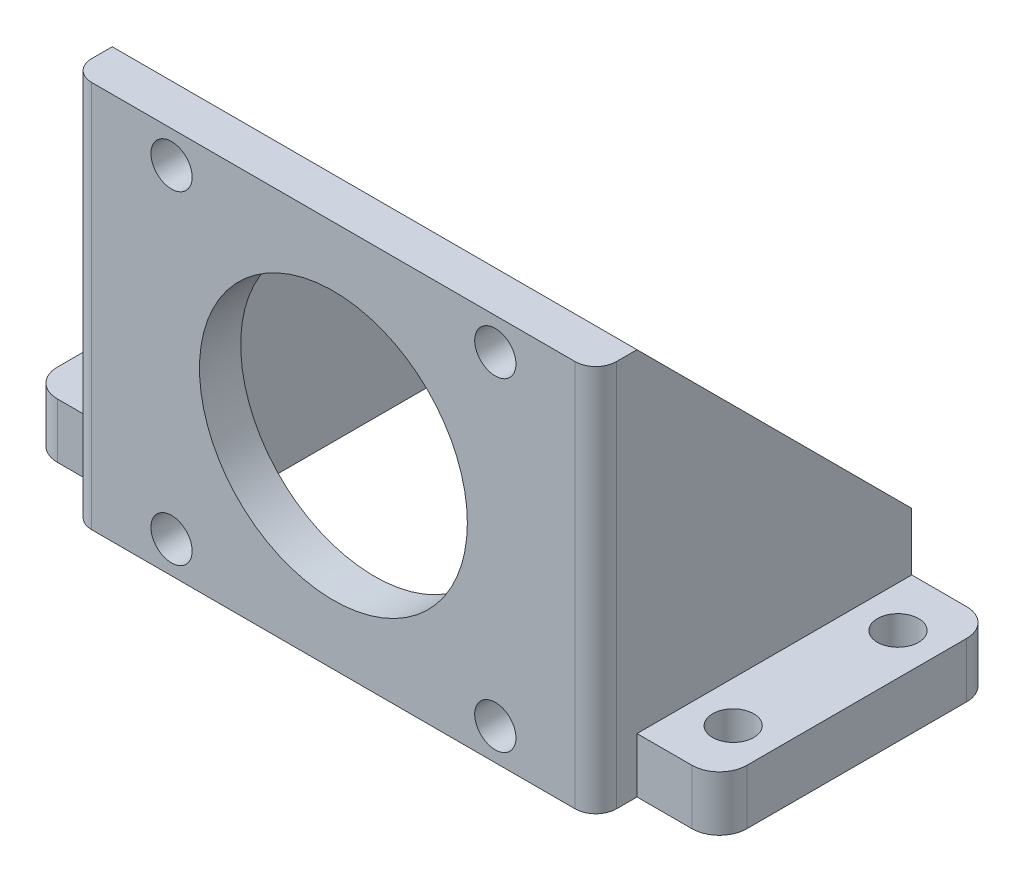
ISO-10303-21;
HEADER;
FILE_DESCRIPTION(('STEP AP214'),'2;1');
FILE_NAME('part.step','',(''),(''),'','','');
FILE_SCHEMA(('AUTOMOTIVE_DESIGN { 1 0 10303 214 1 1 1 1 }'));
ENDSEC;
DATA;
#1=APPLICATION_CONTEXT('core data for automotive mechanical design processes');
#2=APPLICATION_PROTOCOL_DEFINITION('international standard','automotive_design',2000,#1);
#3=PRODUCT_CONTEXT('',#1,'mechanical');
#4=PRODUCT('Part','Part','',(#3));
#5=PRODUCT_RELATED_PRODUCT_CATEGORY('part','',(#4));
#6=PRODUCT_DEFINITION_FORMATION('','',#4);
#7=PRODUCT_DEFINITION_CONTEXT('part definition',#1,'design');
#8=PRODUCT_DEFINITION('design','',#6,#7);
#9=PRODUCT_DEFINITION_SHAPE('','',#8);
#10=(LENGTH_UNIT() NAMED_UNIT(*) SI_UNIT(.MILLI.,.METRE.));
#11=(NAMED_UNIT(*) PLANE_ANGLE_UNIT() SI_UNIT($,.RADIAN.));
#12=(NAMED_UNIT(*) SI_UNIT($,.STERADIAN.) SOLID_ANGLE_UNIT());
#13=UNCERTAINTY_MEASURE_WITH_UNIT(LENGTH_MEASURE(1.E-05),#10,'distance_accuracy_value','');
#14=(GEOMETRIC_REPRESENTATION_CONTEXT(3) GLOBAL_UNCERTAINTY_ASSIGNED_CONTEXT((#13)) GLOBAL_UNIT_ASSIGNED_CONTEXT((#10,
#11,#12)) REPRESENTATION_CONTEXT('',''));
#15=CARTESIAN_POINT('',(0.,0.,0.));
#16=DIRECTION('',(0.,0.,1.));
#17=DIRECTION('',(1.,0.,0.));
#18=AXIS2_PLACEMENT_3D('',#15,#16,#17);
#19=CARTESIAN_POINT('',(76.4,0.,6.));
#20=DIRECTION('',(-1.,0.,0.));
#21=DIRECTION('',(0.,0.,1.));
#22=AXIS2_PLACEMENT_3D('',#19,#20,#21);
#23=PLANE('',#22);
#24=DIRECTION('',(0.,-1.,0.));
#25=VECTOR('',#24,1.);
#26=CARTESIAN_POINT('',(76.4,0.,-40.));
#27=LINE('',#26,#25);
#28=CARTESIAN_POINT('',(76.4,16.4,-40.));
#29=VERTEX_POINT('',#28);
#30=CARTESIAN_POINT('',(76.4,8.,-40.));
#31=VERTEX_POINT('',#30);
#32=EDGE_CURVE('E279',#29,#31,#27,.T.);
#33=ORIENTED_EDGE('',*,*,#32,.F.);
#34=DIRECTION('',(0.,-0.707106781186546,-0.707106781186549));
#35=VECTOR('',#34,1.);
#36=CARTESIAN_POINT('',(76.4,16.4,-40.));
#37=LINE('',#36,#35);
#38=CARTESIAN_POINT('',(76.4,56.4,1.45716771982052E-13));
#39=VERTEX_POINT('',#38);
#40=EDGE_CURVE('E41',#29,#39,#37,.F.);
#41=ORIENTED_EDGE('',*,*,#40,.T.);
#42=DIRECTION('',(0.,0.,-1.));
#43=VECTOR('',#42,1.);
#44=CARTESIAN_POINT('',(76.4,56.4,6.));
#45=LINE('',#44,#43);
#46=CARTESIAN_POINT('',(76.4,56.4,3.));
#47=VERTEX_POINT('',#46);
#48=EDGE_CURVE('E206',#47,#39,#45,.T.);
#49=ORIENTED_EDGE('',*,*,#48,.F.);
#50=DIRECTION('',(0.,1.,0.));
#51=VECTOR('',#50,1.);
#52=CARTESIAN_POINT('',(76.4,0.,3.));
#53=LINE('',#52,#51);
#54=CARTESIAN_POINT('',(76.4,0.,3.));
#55=VERTEX_POINT('',#54);
#56=EDGE_CURVE('E204',#47,#55,#53,.F.);
#57=ORIENTED_EDGE('',*,*,#56,.T.);
#58=DIRECTION('',(0.,0.,-1.));
#59=VECTOR('',#58,1.);
#60=CARTESIAN_POINT('',(76.4,0.,6.));
#61=LINE('',#60,#59);
#62=CARTESIAN_POINT('',(76.4,0.,0.));
#63=VERTEX_POINT('',#62);
#64=EDGE_CURVE('E181',#55,#63,#61,.T.);
#65=ORIENTED_EDGE('',*,*,#64,.T.);
#66=DIRECTION('',(0.,-1.,0.));
#67=VECTOR('',#66,1.);
#68=CARTESIAN_POINT('',(76.4,0.,0.));
#69=LINE('',#68,#67);
#70=CARTESIAN_POINT('',(76.4,8.,0.));
#71=VERTEX_POINT('',#70);
#72=EDGE_CURVE('E191',#71,#63,#69,.T.);
#73=ORIENTED_EDGE('',*,*,#72,.F.);
#74=DIRECTION('',(0.,0.,1.));
#75=VECTOR('',#74,1.);
#76=CARTESIAN_POINT('',(76.4,8.,0.));
#77=LINE('',#76,#75);
#78=EDGE_CURVE('E198',#31,#71,#77,.T.);
#79=ORIENTED_EDGE('',*,*,#78,.F.);
#80=EDGE_LOOP('',(#33,#41,#49,#57,#65,#73,#79));
#81=FACE_BOUND('',#80,.T.);
#82=ADVANCED_FACE('F33',(#81),#23,.F.);
#83=CARTESIAN_POINT('',(0.,0.,6.));
#84=DIRECTION('',(1.,0.,0.));
#85=DIRECTION('',(0.,0.,-1.));
#86=AXIS2_PLACEMENT_3D('',#83,#84,#85);
#87=PLANE('',#86);
#88=DIRECTION('',(0.,0.,-1.));
#89=VECTOR('',#88,1.);
#90=CARTESIAN_POINT('',(0.,56.4,6.));
#91=LINE('',#90,#89);
#92=CARTESIAN_POINT('',(0.,56.4,3.));
#93=VERTEX_POINT('',#92);
#94=CARTESIAN_POINT('',(0.,56.4,1.45716771982052E-13));
#95=VERTEX_POINT('',#94);
#96=EDGE_CURVE('E212',#93,#95,#91,.T.);
#97=ORIENTED_EDGE('',*,*,#96,.T.);
#98=DIRECTION('',(0.,-0.707106781186546,-0.707106781186549));
#99=VECTOR('',#98,1.);
#100=CARTESIAN_POINT('',(0.,16.4,-40.));
#101=LINE('',#100,#99);
#102=CARTESIAN_POINT('',(0.,16.4,-40.));
#103=VERTEX_POINT('',#102);
#104=EDGE_CURVE('E276',#95,#103,#101,.T.);
#105=ORIENTED_EDGE('',*,*,#104,.T.);
#106=DIRECTION('',(0.,1.,0.));
#107=VECTOR('',#106,1.);
#108=CARTESIAN_POINT('',(0.,0.,-40.));
#109=LINE('',#108,#107);
#110=CARTESIAN_POINT('',(0.,8.,-40.));
#111=VERTEX_POINT('',#110);
#112=EDGE_CURVE('E362',#111,#103,#109,.T.);
#113=ORIENTED_EDGE('',*,*,#112,.F.);
#114=DIRECTION('',(0.,0.,-1.));
#115=VECTOR('',#114,1.);
#116=CARTESIAN_POINT('',(0.,8.,-40.));
#117=LINE('',#116,#115);
#118=CARTESIAN_POINT('',(0.,8.,0.));
#119=VERTEX_POINT('',#118);
#120=EDGE_CURVE('E409',#119,#111,#117,.T.);
#121=ORIENTED_EDGE('',*,*,#120,.F.);
#122=DIRECTION('',(0.,1.,0.));
#123=VECTOR('',#122,1.);
#124=CARTESIAN_POINT('',(0.,0.,0.));
#125=LINE('',#124,#123);
#126=CARTESIAN_POINT('',(0.,0.,0.));
#127=VERTEX_POINT('',#126);
#128=EDGE_CURVE('E187',#127,#119,#125,.T.);
#129=ORIENTED_EDGE('',*,*,#128,.F.);
#130=DIRECTION('',(0.,0.,-1.));
#131=VECTOR('',#130,1.);
#132=CARTESIAN_POINT('',(0.,0.,6.));
#133=LINE('',#132,#131);
#134=CARTESIAN_POINT('',(0.,0.,3.));
#135=VERTEX_POINT('',#134);
#136=EDGE_CURVE('E205',#135,#127,#133,.T.);
#137=ORIENTED_EDGE('',*,*,#136,.F.);
#138=DIRECTION('',(0.,-1.,0.));
#139=VECTOR('',#138,1.);
#140=CARTESIAN_POINT('',(0.,0.,3.));
#141=LINE('',#140,#139);
#142=EDGE_CURVE('E230',#135,#93,#141,.F.);
#143=ORIENTED_EDGE('',*,*,#142,.T.);
#144=EDGE_LOOP('',(#97,#105,#113,#121,#129,#137,#143));
#145=FACE_BOUND('',#144,.T.);
#146=ADVANCED_FACE('F346',(#145),#87,.F.);
#147=CARTESIAN_POINT('',(0.,0.,0.));
#148=DIRECTION('',(0.,0.,-1.));
#149=DIRECTION('',(-1.,0.,0.));
#150=AXIS2_PLACEMENT_3D('',#147,#148,#149);
#151=PLANE('',#150);
#152=CARTESIAN_POINT('',(61.77,4.63,0.));
#153=DIRECTION('',(0.,0.,1.));
#154=DIRECTION('',(1.,0.,0.));
#155=AXIS2_PLACEMENT_3D('',#152,#153,#154);
#156=CIRCLE('',#155,3.00000000000001);
#157=CARTESIAN_POINT('',(64.77,4.63,0.));
#158=VERTEX_POINT('',#157);
#159=EDGE_CURVE('E307',#158,#158,#156,.T.);
#160=ORIENTED_EDGE('',*,*,#159,.T.);
#161=EDGE_LOOP('',(#160));
#162=FACE_BOUND('',#161,.T.);
#163=CARTESIAN_POINT('',(14.63,51.77,0.));
#164=DIRECTION('',(0.,0.,1.));
#165=DIRECTION('',(1.,0.,0.));
#166=AXIS2_PLACEMENT_3D('',#163,#164,#165);
#167=CIRCLE('',#166,2.99999999999999);
#168=CARTESIAN_POINT('',(17.63,51.77,0.));
#169=VERTEX_POINT('',#168);
#170=EDGE_CURVE('E319',#169,#169,#167,.T.);
#171=ORIENTED_EDGE('',*,*,#170,.T.);
#172=EDGE_LOOP('',(#171));
#173=FACE_BOUND('',#172,.T.);
#174=CARTESIAN_POINT('',(38.2,28.2,0.));
#175=DIRECTION('',(0.,0.,1.));
#176=DIRECTION('',(1.,0.,0.));
#177=AXIS2_PLACEMENT_3D('',#174,#175,#176);
#178=CIRCLE('',#177,19.5);
#179=CARTESIAN_POINT('',(57.7,28.2,0.));
#180=VERTEX_POINT('',#179);
#181=EDGE_CURVE('E325',#180,#180,#178,.T.);
#182=ORIENTED_EDGE('',*,*,#181,.T.);
#183=EDGE_LOOP('',(#182));
#184=FACE_BOUND('',#183,.T.);
#185=CARTESIAN_POINT('',(61.77,51.77,0.));
#186=DIRECTION('',(0.,0.,1.));
#187=DIRECTION('',(1.,0.,0.));
#188=AXIS2_PLACEMENT_3D('',#185,#186,#187);
#189=CIRCLE('',#188,3.00000000000001);
#190=CARTESIAN_POINT('',(64.77,51.77,0.));
#191=VERTEX_POINT('',#190);
#192=EDGE_CURVE('E313',#191,#191,#189,.T.);
#193=ORIENTED_EDGE('',*,*,#192,.T.);
#194=EDGE_LOOP('',(#193));
#195=FACE_BOUND('',#194,.T.);
#196=CARTESIAN_POINT('',(14.63,4.63,0.));
#197=DIRECTION('',(0.,0.,1.));
#198=DIRECTION('',(1.,0.,0.));
#199=AXIS2_PLACEMENT_3D('',#196,#197,#198);
#200=CIRCLE('',#199,2.99999999999999);
#201=CARTESIAN_POINT('',(17.63,4.63,0.));
#202=VERTEX_POINT('',#201);
#203=EDGE_CURVE('E296',#202,#202,#200,.T.);
#204=ORIENTED_EDGE('',*,*,#203,.T.);
#205=EDGE_LOOP('',(#204));
#206=FACE_BOUND('',#205,.T.);
#207=DIRECTION('',(1.,0.,0.));
#208=VECTOR('',#207,1.);
#209=CARTESIAN_POINT('',(0.,0.,0.));
#210=LINE('',#209,#208);
#211=CARTESIAN_POINT('',(9.5,0.,0.));
#212=VERTEX_POINT('',#211);
#213=CARTESIAN_POINT('',(66.9,0.,0.));
#214=VERTEX_POINT('',#213);
#215=EDGE_CURVE('E331',#212,#214,#210,.T.);
#216=ORIENTED_EDGE('',*,*,#215,.F.);
#217=DIRECTION('',(0.,-1.,0.));
#218=VECTOR('',#217,1.);
#219=CARTESIAN_POINT('',(9.5,0.,0.));
#220=LINE('',#219,#218);
#221=CARTESIAN_POINT('',(9.49999999999999,56.4,0.));
#222=VERTEX_POINT('',#221);
#223=EDGE_CURVE('E371',#222,#212,#220,.T.);
#224=ORIENTED_EDGE('',*,*,#223,.F.);
#225=DIRECTION('',(-1.,0.,0.));
#226=VECTOR('',#225,1.);
#227=CARTESIAN_POINT('',(0.,56.4,0.));
#228=LINE('',#227,#226);
#229=CARTESIAN_POINT('',(66.9,56.4,0.));
#230=VERTEX_POINT('',#229);
#231=EDGE_CURVE('E338',#230,#222,#228,.T.);
#232=ORIENTED_EDGE('',*,*,#231,.F.);
#233=DIRECTION('',(0.,1.,0.));
#234=VECTOR('',#233,1.);
#235=CARTESIAN_POINT('',(66.9,0.,0.));
#236=LINE('',#235,#234);
#237=EDGE_CURVE('E301',#214,#230,#236,.T.);
#238=ORIENTED_EDGE('',*,*,#237,.F.);
#239=EDGE_LOOP('',(#216,#224,#232,#238));
#240=FACE_BOUND('',#239,.T.);
#241=ADVANCED_FACE('F380',(#162,#173,#184,#195,#206,#240),#151,.T.);
#242=CARTESIAN_POINT('',(0.,0.,6.));
#243=DIRECTION('',(0.,0.,-1.));
#244=DIRECTION('',(-1.,0.,0.));
#245=AXIS2_PLACEMENT_3D('',#242,#243,#244);
#246=PLANE('',#245);
#247=DIRECTION('',(1.,0.,0.));
#248=VECTOR('',#247,1.);
#249=CARTESIAN_POINT('',(0.,0.,6.));
#250=LINE('',#249,#248);
#251=CARTESIAN_POINT('',(3.,0.,6.));
#252=VERTEX_POINT('',#251);
#253=CARTESIAN_POINT('',(73.4,0.,6.));
#254=VERTEX_POINT('',#253);
#255=EDGE_CURVE('E334',#252,#254,#250,.T.);
#256=ORIENTED_EDGE('',*,*,#255,.T.);
#257=DIRECTION('',(0.,1.,0.));
#258=VECTOR('',#257,1.);
#259=CARTESIAN_POINT('',(73.4,0.,6.));
#260=LINE('',#259,#258);
#261=CARTESIAN_POINT('',(73.4,56.4,6.));
#262=VERTEX_POINT('',#261);
#263=EDGE_CURVE('E218',#254,#262,#260,.T.);
#264=ORIENTED_EDGE('',*,*,#263,.T.);
#265=DIRECTION('',(-1.,0.,0.));
#266=VECTOR('',#265,1.);
#267=CARTESIAN_POINT('',(0.,56.4,6.));
#268=LINE('',#267,#266);
#269=CARTESIAN_POINT('',(3.,56.4,6.));
#270=VERTEX_POINT('',#269);
#271=EDGE_CURVE('E337',#262,#270,#268,.T.);
#272=ORIENTED_EDGE('',*,*,#271,.T.);
#273=DIRECTION('',(0.,-1.,0.));
#274=VECTOR('',#273,1.);
#275=CARTESIAN_POINT('',(3.,0.,6.));
#276=LINE('',#275,#274);
#277=EDGE_CURVE('E209',#270,#252,#276,.T.);
#278=ORIENTED_EDGE('',*,*,#277,.T.);
#279=EDGE_LOOP('',(#256,#264,#272,#278));
#280=FACE_BOUND('',#279,.T.);
#281=CARTESIAN_POINT('',(38.2,28.2,6.));
#282=DIRECTION('',(0.,0.,1.));
#283=DIRECTION('',(1.,0.,0.));
#284=AXIS2_PLACEMENT_3D('',#281,#282,#283);
#285=CIRCLE('',#284,19.5);
#286=CARTESIAN_POINT('',(57.7,28.2,6.));
#287=VERTEX_POINT('',#286);
#288=EDGE_CURVE('E328',#287,#287,#285,.T.);
#289=ORIENTED_EDGE('',*,*,#288,.F.);
#290=EDGE_LOOP('',(#289));
#291=FACE_BOUND('',#290,.T.);
#292=CARTESIAN_POINT('',(14.63,51.77,6.));
#293=DIRECTION('',(0.,0.,1.));
#294=DIRECTION('',(1.,0.,0.));
#295=AXIS2_PLACEMENT_3D('',#292,#293,#294);
#296=CIRCLE('',#295,2.99999999999999);
#297=CARTESIAN_POINT('',(17.63,51.77,6.));
#298=VERTEX_POINT('',#297);
#299=EDGE_CURVE('E322',#298,#298,#296,.T.);
#300=ORIENTED_EDGE('',*,*,#299,.F.);
#301=EDGE_LOOP('',(#300));
#302=FACE_BOUND('',#301,.T.);
#303=CARTESIAN_POINT('',(61.77,51.77,6.));
#304=DIRECTION('',(0.,0.,1.));
#305=DIRECTION('',(1.,0.,0.));
#306=AXIS2_PLACEMENT_3D('',#303,#304,#305);
#307=CIRCLE('',#306,3.00000000000001);
#308=CARTESIAN_POINT('',(64.77,51.77,6.));
#309=VERTEX_POINT('',#308);
#310=EDGE_CURVE('E316',#309,#309,#307,.T.);
#311=ORIENTED_EDGE('',*,*,#310,.F.);
#312=EDGE_LOOP('',(#311));
#313=FACE_BOUND('',#312,.T.);
#314=CARTESIAN_POINT('',(61.77,4.63,6.));
#315=DIRECTION('',(0.,0.,1.));
#316=DIRECTION('',(1.,0.,0.));
#317=AXIS2_PLACEMENT_3D('',#314,#315,#316);
#318=CIRCLE('',#317,3.00000000000001);
#319=CARTESIAN_POINT('',(64.77,4.63,6.));
#320=VERTEX_POINT('',#319);
#321=EDGE_CURVE('E310',#320,#320,#318,.T.);
#322=ORIENTED_EDGE('',*,*,#321,.F.);
#323=EDGE_LOOP('',(#322));
#324=FACE_BOUND('',#323,.T.);
#325=CARTESIAN_POINT('',(14.63,4.63,6.));
#326=DIRECTION('',(0.,0.,1.));
#327=DIRECTION('',(1.,0.,0.));
#328=AXIS2_PLACEMENT_3D('',#325,#326,#327);
#329=CIRCLE('',#328,2.99999999999999);
#330=CARTESIAN_POINT('',(17.63,4.63,6.));
#331=VERTEX_POINT('',#330);
#332=EDGE_CURVE('E304',#331,#331,#329,.T.);
#333=ORIENTED_EDGE('',*,*,#332,.F.);
#334=EDGE_LOOP('',(#333));
#335=FACE_BOUND('',#334,.T.);
#336=ADVANCED_FACE('F431',(#280,#291,#302,#313,#324,#335),#246,.F.);
#337=CARTESIAN_POINT('',(0.,0.,6.));
#338=DIRECTION('',(0.,1.,0.));
#339=DIRECTION('',(-1.,0.,0.));
#340=AXIS2_PLACEMENT_3D('',#337,#338,#339);
#341=PLANE('',#340);
#342=CARTESIAN_POINT('',(-6.,0.,-8.));
#343=DIRECTION('',(0.,1.,0.));
#344=DIRECTION('',(-1.,0.,0.));
#345=AXIS2_PLACEMENT_3D('',#342,#343,#344);
#346=CIRCLE('',#345,3.);
#347=CARTESIAN_POINT('',(-9.,0.,-8.));
#348=VERTEX_POINT('',#347);
#349=EDGE_CURVE('E464',#348,#348,#346,.T.);
#350=ORIENTED_EDGE('',*,*,#349,.T.);
#351=EDGE_LOOP('',(#350));
#352=FACE_BOUND('',#351,.T.);
#353=CARTESIAN_POINT('',(82.4,0.,-32.));
#354=DIRECTION('',(0.,1.,0.));
#355=DIRECTION('',(-1.,0.,0.));
#356=AXIS2_PLACEMENT_3D('',#353,#354,#355);
#357=CIRCLE('',#356,3.00000000000001);
#358=CARTESIAN_POINT('',(79.4,0.,-32.));
#359=VERTEX_POINT('',#358);
#360=EDGE_CURVE('E468',#359,#359,#357,.T.);
#361=ORIENTED_EDGE('',*,*,#360,.T.);
#362=EDGE_LOOP('',(#361));
#363=FACE_BOUND('',#362,.T.);
#364=CARTESIAN_POINT('',(82.4,0.,-8.));
#365=DIRECTION('',(0.,1.,0.));
#366=DIRECTION('',(-1.,0.,0.));
#367=AXIS2_PLACEMENT_3D('',#364,#365,#366);
#368=CIRCLE('',#367,3.00000000000001);
#369=CARTESIAN_POINT('',(79.4,0.,-8.));
#370=VERTEX_POINT('',#369);
#371=EDGE_CURVE('E472',#370,#370,#368,.T.);
#372=ORIENTED_EDGE('',*,*,#371,.T.);
#373=EDGE_LOOP('',(#372));
#374=FACE_BOUND('',#373,.T.);
#375=CARTESIAN_POINT('',(-6.,0.,-32.));
#376=DIRECTION('',(0.,1.,0.));
#377=DIRECTION('',(-1.,0.,0.));
#378=AXIS2_PLACEMENT_3D('',#375,#376,#377);
#379=CIRCLE('',#378,3.);
#380=CARTESIAN_POINT('',(-9.,0.,-32.));
#381=VERTEX_POINT('',#380);
#382=EDGE_CURVE('E199',#381,#381,#379,.T.);
#383=ORIENTED_EDGE('',*,*,#382,.T.);
#384=EDGE_LOOP('',(#383));
#385=FACE_BOUND('',#384,.T.);
#386=DIRECTION('',(1.,0.,0.));
#387=VECTOR('',#386,1.);
#388=CARTESIAN_POINT('',(-12.,0.,0.));
#389=LINE('',#388,#387);
#390=CARTESIAN_POINT('',(-8.,0.,0.));
#391=VERTEX_POINT('',#390);
#392=EDGE_CURVE('E376',#391,#127,#389,.T.);
#393=ORIENTED_EDGE('',*,*,#392,.F.);
#394=CARTESIAN_POINT('',(-8.,0.,-4.));
#395=DIRECTION('',(0.,1.,0.));
#396=DIRECTION('',(-1.,0.,0.));
#397=AXIS2_PLACEMENT_3D('',#394,#395,#396);
#398=CIRCLE('',#397,4.);
#399=CARTESIAN_POINT('',(-12.,0.,-4.));
#400=VERTEX_POINT('',#399);
#401=EDGE_CURVE('E249',#391,#400,#398,.F.);
#402=ORIENTED_EDGE('',*,*,#401,.T.);
#403=DIRECTION('',(0.,0.,1.));
#404=VECTOR('',#403,1.);
#405=CARTESIAN_POINT('',(-12.,0.,-40.));
#406=LINE('',#405,#404);
#407=CARTESIAN_POINT('',(-12.,0.,-36.));
#408=VERTEX_POINT('',#407);
#409=EDGE_CURVE('E405',#408,#400,#406,.T.);
#410=ORIENTED_EDGE('',*,*,#409,.F.);
#411=CARTESIAN_POINT('',(-8.,0.,-36.));
#412=DIRECTION('',(0.,1.,0.));
#413=DIRECTION('',(-1.,0.,0.));
#414=AXIS2_PLACEMENT_3D('',#411,#412,#413);
#415=CIRCLE('',#414,4.);
#416=CARTESIAN_POINT('',(-8.,0.,-40.));
#417=VERTEX_POINT('',#416);
#418=EDGE_CURVE('E247',#408,#417,#415,.F.);
#419=ORIENTED_EDGE('',*,*,#418,.T.);
#420=DIRECTION('',(-1.,0.,0.));
#421=VECTOR('',#420,1.);
#422=CARTESIAN_POINT('',(0.,0.,-40.));
#423=LINE('',#422,#421);
#424=CARTESIAN_POINT('',(9.5,0.,-40.));
#425=VERTEX_POINT('',#424);
#426=EDGE_CURVE('E368',#425,#417,#423,.T.);
#427=ORIENTED_EDGE('',*,*,#426,.F.);
#428=DIRECTION('',(0.,0.,1.));
#429=VECTOR('',#428,1.);
#430=CARTESIAN_POINT('',(9.5,0.,-40.));
#431=LINE('',#430,#429);
#432=EDGE_CURVE('E302',#425,#212,#431,.T.);
#433=ORIENTED_EDGE('',*,*,#432,.T.);
#434=ORIENTED_EDGE('',*,*,#215,.T.);
#435=DIRECTION('',(0.,0.,1.));
#436=VECTOR('',#435,1.);
#437=CARTESIAN_POINT('',(66.9,0.,-40.));
#438=LINE('',#437,#436);
#439=CARTESIAN_POINT('',(66.9,0.,-40.));
#440=VERTEX_POINT('',#439);
#441=EDGE_CURVE('E294',#440,#214,#438,.T.);
#442=ORIENTED_EDGE('',*,*,#441,.F.);
#443=DIRECTION('',(-1.,0.,0.));
#444=VECTOR('',#443,1.);
#445=CARTESIAN_POINT('',(76.4,0.,-40.));
#446=LINE('',#445,#444);
#447=CARTESIAN_POINT('',(84.4,0.,-40.));
#448=VERTEX_POINT('',#447);
#449=EDGE_CURVE('E291',#448,#440,#446,.T.);
#450=ORIENTED_EDGE('',*,*,#449,.F.);
#451=CARTESIAN_POINT('',(84.4,0.,-36.));
#452=DIRECTION('',(0.,1.,0.));
#453=DIRECTION('',(-1.,0.,0.));
#454=AXIS2_PLACEMENT_3D('',#451,#452,#453);
#455=CIRCLE('',#454,4.);
#456=CARTESIAN_POINT('',(88.4,0.,-36.));
#457=VERTEX_POINT('',#456);
#458=EDGE_CURVE('E245',#448,#457,#455,.F.);
#459=ORIENTED_EDGE('',*,*,#458,.T.);
#460=DIRECTION('',(0.,0.,-1.));
#461=VECTOR('',#460,1.);
#462=CARTESIAN_POINT('',(88.4,0.,0.));
#463=LINE('',#462,#461);
#464=CARTESIAN_POINT('',(88.4,0.,-4.));
#465=VERTEX_POINT('',#464);
#466=EDGE_CURVE('E394',#465,#457,#463,.T.);
#467=ORIENTED_EDGE('',*,*,#466,.F.);
#468=CARTESIAN_POINT('',(84.4,0.,-4.));
#469=DIRECTION('',(0.,1.,0.));
#470=DIRECTION('',(-1.,0.,0.));
#471=AXIS2_PLACEMENT_3D('',#468,#469,#470);
#472=CIRCLE('',#471,4.);
#473=CARTESIAN_POINT('',(84.4,0.,0.));
#474=VERTEX_POINT('',#473);
#475=EDGE_CURVE('E184',#465,#474,#472,.F.);
#476=ORIENTED_EDGE('',*,*,#475,.T.);
#477=DIRECTION('',(-1.,0.,0.));
#478=VECTOR('',#477,1.);
#479=CARTESIAN_POINT('',(88.4,0.,0.));
#480=LINE('',#479,#478);
#481=EDGE_CURVE('E176',#474,#63,#480,.T.);
#482=ORIENTED_EDGE('',*,*,#481,.T.);
#483=ORIENTED_EDGE('',*,*,#64,.F.);
#484=CARTESIAN_POINT('',(73.4,0.,3.));
#485=DIRECTION('',(0.,1.,0.));
#486=DIRECTION('',(-1.,0.,0.));
#487=AXIS2_PLACEMENT_3D('',#484,#485,#486);
#488=CIRCLE('',#487,3.);
#489=EDGE_CURVE('E228',#55,#254,#488,.F.);
#490=ORIENTED_EDGE('',*,*,#489,.T.);
#491=ORIENTED_EDGE('',*,*,#255,.F.);
#492=CARTESIAN_POINT('',(3.,0.,3.));
#493=DIRECTION('',(0.,1.,0.));
#494=DIRECTION('',(-1.,0.,0.));
#495=AXIS2_PLACEMENT_3D('',#492,#493,#494);
#496=CIRCLE('',#495,3.);
#497=EDGE_CURVE('E226',#252,#135,#496,.F.);
#498=ORIENTED_EDGE('',*,*,#497,.T.);
#499=ORIENTED_EDGE('',*,*,#136,.T.);
#500=EDGE_LOOP('',(#393,#402,#410,#419,#427,#433,#434,#442,#450,#459,#467,#476,#482,#483,#490,
#491,#498,#499));
#501=FACE_BOUND('',#500,.T.);
#502=ADVANCED_FACE('F179',(#352,#363,#374,#385,#501),#341,.F.);
#503=CARTESIAN_POINT('',(0.,56.4,6.));
#504=DIRECTION('',(0.,-1.,0.));
#505=DIRECTION('',(1.,0.,0.));
#506=AXIS2_PLACEMENT_3D('',#503,#504,#505);
#507=PLANE('',#506);
#508=ORIENTED_EDGE('',*,*,#231,.T.);
#509=DIRECTION('',(-1.,0.,0.));
#510=VECTOR('',#509,1.);
#511=CARTESIAN_POINT('',(0.,56.4,1.45716771982052E-13));
#512=LINE('',#511,#510);
#513=EDGE_CURVE('E274',#222,#95,#512,.T.);
#514=ORIENTED_EDGE('',*,*,#513,.T.);
#515=ORIENTED_EDGE('',*,*,#96,.F.);
#516=CARTESIAN_POINT('',(3.,56.4,3.));
#517=DIRECTION('',(0.,-1.,0.));
#518=DIRECTION('',(1.,0.,0.));
#519=AXIS2_PLACEMENT_3D('',#516,#517,#518);
#520=CIRCLE('',#519,3.);
#521=EDGE_CURVE('E221',#93,#270,#520,.F.);
#522=ORIENTED_EDGE('',*,*,#521,.T.);
#523=ORIENTED_EDGE('',*,*,#271,.F.);
#524=CARTESIAN_POINT('',(73.4,56.4,3.));
#525=DIRECTION('',(0.,-1.,0.));
#526=DIRECTION('',(1.,0.,0.));
#527=AXIS2_PLACEMENT_3D('',#524,#525,#526);
#528=CIRCLE('',#527,3.);
#529=EDGE_CURVE('E223',#262,#47,#528,.F.);
#530=ORIENTED_EDGE('',*,*,#529,.T.);
#531=ORIENTED_EDGE('',*,*,#48,.T.);
#532=DIRECTION('',(-1.,0.,0.));
#533=VECTOR('',#532,1.);
#534=CARTESIAN_POINT('',(0.,56.4,1.45716771982052E-13));
#535=LINE('',#534,#533);
#536=EDGE_CURVE('E272',#39,#230,#535,.T.);
#537=ORIENTED_EDGE('',*,*,#536,.T.);
#538=EDGE_LOOP('',(#508,#514,#515,#522,#523,#530,#531,#537));
#539=FACE_BOUND('',#538,.T.);
#540=ADVANCED_FACE('F282',(#539),#507,.F.);
#541=CARTESIAN_POINT('',(38.2,28.2,6.));
#542=DIRECTION('',(0.,0.,-1.));
#543=DIRECTION('',(-1.,0.,0.));
#544=AXIS2_PLACEMENT_3D('',#541,#542,#543);
#545=CYLINDRICAL_SURFACE('',#544,19.5);
#546=ORIENTED_EDGE('',*,*,#288,.T.);
#547=EDGE_LOOP('',(#546));
#548=FACE_BOUND('',#547,.T.);
#549=ORIENTED_EDGE('',*,*,#181,.F.);
#550=EDGE_LOOP('',(#549));
#551=FACE_BOUND('',#550,.T.);
#552=ADVANCED_FACE('F459',(#548,#551),#545,.F.);
#553=CARTESIAN_POINT('',(14.63,51.77,6.));
#554=DIRECTION('',(0.,0.,-1.));
#555=DIRECTION('',(-1.,0.,0.));
#556=AXIS2_PLACEMENT_3D('',#553,#554,#555);
#557=CYLINDRICAL_SURFACE('',#556,2.99999999999999);
#558=ORIENTED_EDGE('',*,*,#299,.T.);
#559=EDGE_LOOP('',(#558));
#560=FACE_BOUND('',#559,.T.);
#561=ORIENTED_EDGE('',*,*,#170,.F.);
#562=EDGE_LOOP('',(#561));
#563=FACE_BOUND('',#562,.T.);
#564=ADVANCED_FACE('F576',(#560,#563),#557,.F.);
#565=CARTESIAN_POINT('',(61.77,51.77,6.));
#566=DIRECTION('',(0.,0.,-1.));
#567=DIRECTION('',(-1.,0.,0.));
#568=AXIS2_PLACEMENT_3D('',#565,#566,#567);
#569=CYLINDRICAL_SURFACE('',#568,3.00000000000001);
#570=ORIENTED_EDGE('',*,*,#310,.T.);
#571=EDGE_LOOP('',(#570));
#572=FACE_BOUND('',#571,.T.);
#573=ORIENTED_EDGE('',*,*,#192,.F.);
#574=EDGE_LOOP('',(#573));
#575=FACE_BOUND('',#574,.T.);
#576=ADVANCED_FACE('F572',(#572,#575),#569,.F.);
#577=CARTESIAN_POINT('',(61.77,4.63,6.));
#578=DIRECTION('',(0.,0.,-1.));
#579=DIRECTION('',(-1.,0.,0.));
#580=AXIS2_PLACEMENT_3D('',#577,#578,#579);
#581=CYLINDRICAL_SURFACE('',#580,3.00000000000001);
#582=ORIENTED_EDGE('',*,*,#321,.T.);
#583=EDGE_LOOP('',(#582));
#584=FACE_BOUND('',#583,.T.);
#585=ORIENTED_EDGE('',*,*,#159,.F.);
#586=EDGE_LOOP('',(#585));
#587=FACE_BOUND('',#586,.T.);
#588=ADVANCED_FACE('F568',(#584,#587),#581,.F.);
#589=CARTESIAN_POINT('',(14.63,4.63,6.));
#590=DIRECTION('',(0.,0.,-1.));
#591=DIRECTION('',(-1.,0.,0.));
#592=AXIS2_PLACEMENT_3D('',#589,#590,#591);
#593=CYLINDRICAL_SURFACE('',#592,2.99999999999999);
#594=ORIENTED_EDGE('',*,*,#332,.T.);
#595=EDGE_LOOP('',(#594));
#596=FACE_BOUND('',#595,.T.);
#597=ORIENTED_EDGE('',*,*,#203,.F.);
#598=EDGE_LOOP('',(#597));
#599=FACE_BOUND('',#598,.T.);
#600=ADVANCED_FACE('F565',(#596,#599),#593,.F.);
#601=CARTESIAN_POINT('',(66.9,0.,-40.));
#602=DIRECTION('',(1.,0.,0.));
#603=DIRECTION('',(0.,0.,-1.));
#604=AXIS2_PLACEMENT_3D('',#601,#602,#603);
#605=PLANE('',#604);
#606=ORIENTED_EDGE('',*,*,#237,.T.);
#607=DIRECTION('',(0.,0.707106781186546,0.707106781186549));
#608=VECTOR('',#607,1.);
#609=CARTESIAN_POINT('',(66.9,16.4,-40.));
#610=LINE('',#609,#608);
#611=CARTESIAN_POINT('',(66.9,16.4,-40.));
#612=VERTEX_POINT('',#611);
#613=EDGE_CURVE('E11',#230,#612,#610,.F.);
#614=ORIENTED_EDGE('',*,*,#613,.T.);
#615=DIRECTION('',(0.,1.,0.));
#616=VECTOR('',#615,1.);
#617=CARTESIAN_POINT('',(66.9,0.,-40.));
#618=LINE('',#617,#616);
#619=EDGE_CURVE('E289',#440,#612,#618,.T.);
#620=ORIENTED_EDGE('',*,*,#619,.F.);
#621=ORIENTED_EDGE('',*,*,#441,.T.);
#622=EDGE_LOOP('',(#606,#614,#620,#621));
#623=FACE_BOUND('',#622,.T.);
#624=ADVANCED_FACE('F381',(#623),#605,.F.);
#625=CARTESIAN_POINT('',(0.,0.,-40.));
#626=DIRECTION('',(0.,0.,1.));
#627=DIRECTION('',(1.,0.,0.));
#628=AXIS2_PLACEMENT_3D('',#625,#626,#627);
#629=PLANE('',#628);
#630=ORIENTED_EDGE('',*,*,#619,.T.);
#631=DIRECTION('',(1.,0.,0.));
#632=VECTOR('',#631,1.);
#633=CARTESIAN_POINT('',(0.,16.4,-40.));
#634=LINE('',#633,#632);
#635=EDGE_CURVE('E278',#612,#29,#634,.T.);
#636=ORIENTED_EDGE('',*,*,#635,.T.);
#637=ORIENTED_EDGE('',*,*,#32,.T.);
#638=DIRECTION('',(-1.,0.,0.));
#639=VECTOR('',#638,1.);
#640=CARTESIAN_POINT('',(88.4,8.,-40.));
#641=LINE('',#640,#639);
#642=CARTESIAN_POINT('',(84.4,8.,-40.));
#643=VERTEX_POINT('',#642);
#644=EDGE_CURVE('E188',#643,#31,#641,.T.);
#645=ORIENTED_EDGE('',*,*,#644,.F.);
#646=DIRECTION('',(0.,1.,0.));
#647=VECTOR('',#646,1.);
#648=CARTESIAN_POINT('',(84.4,0.,-40.));
#649=LINE('',#648,#647);
#650=EDGE_CURVE('E263',#643,#448,#649,.F.);
#651=ORIENTED_EDGE('',*,*,#650,.T.);
#652=ORIENTED_EDGE('',*,*,#449,.T.);
#653=EDGE_LOOP('',(#630,#636,#637,#645,#651,#652));
#654=FACE_BOUND('',#653,.T.);
#655=ADVANCED_FACE('F286',(#654),#629,.F.);
#656=CARTESIAN_POINT('',(9.5,0.,-40.));
#657=DIRECTION('',(-1.,0.,0.));
#658=DIRECTION('',(0.,-1.,0.));
#659=AXIS2_PLACEMENT_3D('',#656,#657,#658);
#660=PLANE('',#659);
#661=DIRECTION('',(0.,-1.,0.));
#662=VECTOR('',#661,1.);
#663=CARTESIAN_POINT('',(9.5,0.,-40.));
#664=LINE('',#663,#662);
#665=CARTESIAN_POINT('',(9.5,16.4,-40.));
#666=VERTEX_POINT('',#665);
#667=EDGE_CURVE('E360',#666,#425,#664,.T.);
#668=ORIENTED_EDGE('',*,*,#667,.F.);
#669=DIRECTION('',(0.,0.707106781186546,0.707106781186549));
#670=VECTOR('',#669,1.);
#671=CARTESIAN_POINT('',(9.5,16.4,-40.));
#672=LINE('',#671,#670);
#673=EDGE_CURVE('E270',#666,#222,#672,.T.);
#674=ORIENTED_EDGE('',*,*,#673,.T.);
#675=ORIENTED_EDGE('',*,*,#223,.T.);
#676=ORIENTED_EDGE('',*,*,#432,.F.);
#677=EDGE_LOOP('',(#668,#674,#675,#676));
#678=FACE_BOUND('',#677,.T.);
#679=ADVANCED_FACE('F364',(#678),#660,.F.);
#680=CARTESIAN_POINT('',(0.,0.,-40.));
#681=DIRECTION('',(0.,0.,-1.));
#682=DIRECTION('',(-1.,0.,0.));
#683=AXIS2_PLACEMENT_3D('',#680,#681,#682);
#684=PLANE('',#683);
#685=ORIENTED_EDGE('',*,*,#112,.T.);
#686=DIRECTION('',(1.,0.,0.));
#687=VECTOR('',#686,1.);
#688=CARTESIAN_POINT('',(9.5,16.4,-40.));
#689=LINE('',#688,#687);
#690=EDGE_CURVE('E267',#103,#666,#689,.T.);
#691=ORIENTED_EDGE('',*,*,#690,.T.);
#692=ORIENTED_EDGE('',*,*,#667,.T.);
#693=ORIENTED_EDGE('',*,*,#426,.T.);
#694=DIRECTION('',(0.,-1.,0.));
#695=VECTOR('',#694,1.);
#696=CARTESIAN_POINT('',(-8.,8.,-40.));
#697=LINE('',#696,#695);
#698=CARTESIAN_POINT('',(-8.,8.,-40.));
#699=VERTEX_POINT('',#698);
#700=EDGE_CURVE('E251',#417,#699,#697,.F.);
#701=ORIENTED_EDGE('',*,*,#700,.T.);
#702=DIRECTION('',(1.,0.,0.));
#703=VECTOR('',#702,1.);
#704=CARTESIAN_POINT('',(-12.,8.,-40.));
#705=LINE('',#704,#703);
#706=EDGE_CURVE('E412',#699,#111,#705,.T.);
#707=ORIENTED_EDGE('',*,*,#706,.T.);
#708=EDGE_LOOP('',(#685,#691,#692,#693,#701,#707));
#709=FACE_BOUND('',#708,.T.);
#710=ADVANCED_FACE('F358',(#709),#684,.T.);
#711=CARTESIAN_POINT('',(73.4,0.,3.));
#712=DIRECTION('',(0.,1.,0.));
#713=DIRECTION('',(0.,0.,1.));
#714=AXIS2_PLACEMENT_3D('',#711,#712,#713);
#715=CYLINDRICAL_SURFACE('',#714,3.);
#716=ORIENTED_EDGE('',*,*,#489,.F.);
#717=ORIENTED_EDGE('',*,*,#56,.F.);
#718=ORIENTED_EDGE('',*,*,#529,.F.);
#719=ORIENTED_EDGE('',*,*,#263,.F.);
#720=EDGE_LOOP('',(#716,#717,#718,#719));
#721=FACE_BOUND('',#720,.T.);
#722=ADVANCED_FACE('F435',(#721),#715,.T.);
#723=CARTESIAN_POINT('',(3.,0.,3.));
#724=DIRECTION('',(0.,-1.,0.));
#725=DIRECTION('',(0.,0.,-1.));
#726=AXIS2_PLACEMENT_3D('',#723,#724,#725);
#727=CYLINDRICAL_SURFACE('',#726,3.);
#728=ORIENTED_EDGE('',*,*,#521,.F.);
#729=ORIENTED_EDGE('',*,*,#142,.F.);
#730=ORIENTED_EDGE('',*,*,#497,.F.);
#731=ORIENTED_EDGE('',*,*,#277,.F.);
#732=EDGE_LOOP('',(#728,#729,#730,#731));
#733=FACE_BOUND('',#732,.T.);
#734=ADVANCED_FACE('F429',(#733),#727,.T.);
#735=CARTESIAN_POINT('',(-12.,0.,0.));
#736=DIRECTION('',(0.,0.,-1.));
#737=DIRECTION('',(-1.,0.,0.));
#738=AXIS2_PLACEMENT_3D('',#735,#736,#737);
#739=PLANE('',#738);
#740=DIRECTION('',(1.,0.,0.));
#741=VECTOR('',#740,1.);
#742=CARTESIAN_POINT('',(-12.,8.,0.));
#743=LINE('',#742,#741);
#744=CARTESIAN_POINT('',(-8.,8.,0.));
#745=VERTEX_POINT('',#744);
#746=EDGE_CURVE('E418',#745,#119,#743,.T.);
#747=ORIENTED_EDGE('',*,*,#746,.F.);
#748=DIRECTION('',(0.,1.,0.));
#749=VECTOR('',#748,1.);
#750=CARTESIAN_POINT('',(-8.,0.,0.));
#751=LINE('',#750,#749);
#752=EDGE_CURVE('E242',#745,#391,#751,.F.);
#753=ORIENTED_EDGE('',*,*,#752,.T.);
#754=ORIENTED_EDGE('',*,*,#392,.T.);
#755=ORIENTED_EDGE('',*,*,#128,.T.);
#756=EDGE_LOOP('',(#747,#753,#754,#755));
#757=FACE_BOUND('',#756,.T.);
#758=ADVANCED_FACE('F422',(#757),#739,.F.);
#759=CARTESIAN_POINT('',(-12.,8.,-40.));
#760=DIRECTION('',(0.,-1.,0.));
#761=DIRECTION('',(0.,0.,-1.));
#762=AXIS2_PLACEMENT_3D('',#759,#760,#761);
#763=PLANE('',#762);
#764=CARTESIAN_POINT('',(-6.,8.,-8.));
#765=DIRECTION('',(0.,1.,0.));
#766=DIRECTION('',(0.,0.,1.));
#767=AXIS2_PLACEMENT_3D('',#764,#765,#766);
#768=CIRCLE('',#767,3.);
#769=CARTESIAN_POINT('',(-6.,8.,-5.));
#770=VERTEX_POINT('',#769);
#771=EDGE_CURVE('E483',#770,#770,#768,.T.);
#772=ORIENTED_EDGE('',*,*,#771,.F.);
#773=EDGE_LOOP('',(#772));
#774=FACE_BOUND('',#773,.T.);
#775=CARTESIAN_POINT('',(-6.,8.,-32.));
#776=DIRECTION('',(0.,1.,0.));
#777=DIRECTION('',(0.,0.,1.));
#778=AXIS2_PLACEMENT_3D('',#775,#776,#777);
#779=CIRCLE('',#778,3.);
#780=CARTESIAN_POINT('',(-6.,8.,-29.));
#781=VERTEX_POINT('',#780);
#782=EDGE_CURVE('E476',#781,#781,#779,.T.);
#783=ORIENTED_EDGE('',*,*,#782,.F.);
#784=EDGE_LOOP('',(#783));
#785=FACE_BOUND('',#784,.T.);
#786=DIRECTION('',(0.,0.,-1.));
#787=VECTOR('',#786,1.);
#788=CARTESIAN_POINT('',(-12.,8.,-40.));
#789=LINE('',#788,#787);
#790=CARTESIAN_POINT('',(-12.,8.,-4.));
#791=VERTEX_POINT('',#790);
#792=CARTESIAN_POINT('',(-12.,8.,-36.));
#793=VERTEX_POINT('',#792);
#794=EDGE_CURVE('E408',#791,#793,#789,.T.);
#795=ORIENTED_EDGE('',*,*,#794,.F.);
#796=CARTESIAN_POINT('',(-8.,8.,-4.));
#797=DIRECTION('',(0.,-1.,0.));
#798=DIRECTION('',(0.,0.,-1.));
#799=AXIS2_PLACEMENT_3D('',#796,#797,#798);
#800=CIRCLE('',#799,4.);
#801=EDGE_CURVE('E240',#791,#745,#800,.F.);
#802=ORIENTED_EDGE('',*,*,#801,.T.);
#803=ORIENTED_EDGE('',*,*,#746,.T.);
#804=ORIENTED_EDGE('',*,*,#120,.T.);
#805=ORIENTED_EDGE('',*,*,#706,.F.);
#806=CARTESIAN_POINT('',(-8.,8.,-36.));
#807=DIRECTION('',(0.,-1.,0.));
#808=DIRECTION('',(0.,0.,-1.));
#809=AXIS2_PLACEMENT_3D('',#806,#807,#808);
#810=CIRCLE('',#809,4.);
#811=EDGE_CURVE('E238',#699,#793,#810,.F.);
#812=ORIENTED_EDGE('',*,*,#811,.T.);
#813=EDGE_LOOP('',(#795,#802,#803,#804,#805,#812));
#814=FACE_BOUND('',#813,.T.);
#815=ADVANCED_FACE('F496',(#774,#785,#814),#763,.F.);
#816=CARTESIAN_POINT('',(-12.,0.,0.));
#817=DIRECTION('',(1.,0.,0.));
#818=DIRECTION('',(0.,0.,-1.));
#819=AXIS2_PLACEMENT_3D('',#816,#817,#818);
#820=PLANE('',#819);
#821=ORIENTED_EDGE('',*,*,#409,.T.);
#822=DIRECTION('',(0.,1.,0.));
#823=VECTOR('',#822,1.);
#824=CARTESIAN_POINT('',(-12.,0.,-4.));
#825=LINE('',#824,#823);
#826=EDGE_CURVE('E235',#400,#791,#825,.T.);
#827=ORIENTED_EDGE('',*,*,#826,.T.);
#828=ORIENTED_EDGE('',*,*,#794,.T.);
#829=DIRECTION('',(0.,-1.,0.));
#830=VECTOR('',#829,1.);
#831=CARTESIAN_POINT('',(-12.,0.,-36.));
#832=LINE('',#831,#830);
#833=EDGE_CURVE('E232',#793,#408,#832,.T.);
#834=ORIENTED_EDGE('',*,*,#833,.T.);
#835=EDGE_LOOP('',(#821,#827,#828,#834));
#836=FACE_BOUND('',#835,.T.);
#837=ADVANCED_FACE('F499',(#836),#820,.F.);
#838=CARTESIAN_POINT('',(88.4,0.,0.));
#839=DIRECTION('',(0.,0.,-1.));
#840=DIRECTION('',(-1.,0.,0.));
#841=AXIS2_PLACEMENT_3D('',#838,#839,#840);
#842=PLANE('',#841);
#843=ORIENTED_EDGE('',*,*,#481,.F.);
#844=DIRECTION('',(0.,-1.,0.));
#845=VECTOR('',#844,1.);
#846=CARTESIAN_POINT('',(84.4,0.,0.));
#847=LINE('',#846,#845);
#848=CARTESIAN_POINT('',(84.4,8.,0.));
#849=VERTEX_POINT('',#848);
#850=EDGE_CURVE('E265',#474,#849,#847,.F.);
#851=ORIENTED_EDGE('',*,*,#850,.T.);
#852=DIRECTION('',(-1.,0.,0.));
#853=VECTOR('',#852,1.);
#854=CARTESIAN_POINT('',(88.4,8.,0.));
#855=LINE('',#854,#853);
#856=EDGE_CURVE('E194',#849,#71,#855,.T.);
#857=ORIENTED_EDGE('',*,*,#856,.T.);
#858=ORIENTED_EDGE('',*,*,#72,.T.);
#859=EDGE_LOOP('',(#843,#851,#857,#858));
#860=FACE_BOUND('',#859,.T.);
#861=ADVANCED_FACE('F192',(#860),#842,.F.);
#862=CARTESIAN_POINT('',(88.4,8.,0.));
#863=DIRECTION('',(0.,-1.,0.));
#864=DIRECTION('',(0.,0.,-1.));
#865=AXIS2_PLACEMENT_3D('',#862,#863,#864);
#866=PLANE('',#865);
#867=CARTESIAN_POINT('',(82.4,8.,-32.));
#868=DIRECTION('',(0.,1.,0.));
#869=DIRECTION('',(0.,0.,1.));
#870=AXIS2_PLACEMENT_3D('',#867,#868,#869);
#871=CIRCLE('',#870,3.00000000000001);
#872=CARTESIAN_POINT('',(82.4,8.,-29.));
#873=VERTEX_POINT('',#872);
#874=EDGE_CURVE('E487',#873,#873,#871,.T.);
#875=ORIENTED_EDGE('',*,*,#874,.F.);
#876=EDGE_LOOP('',(#875));
#877=FACE_BOUND('',#876,.T.);
#878=CARTESIAN_POINT('',(82.4,8.,-8.));
#879=DIRECTION('',(0.,1.,0.));
#880=DIRECTION('',(0.,0.,1.));
#881=AXIS2_PLACEMENT_3D('',#878,#879,#880);
#882=CIRCLE('',#881,3.00000000000001);
#883=CARTESIAN_POINT('',(82.4,8.,-4.99999999999999));
#884=VERTEX_POINT('',#883);
#885=EDGE_CURVE('E484',#884,#884,#882,.T.);
#886=ORIENTED_EDGE('',*,*,#885,.F.);
#887=EDGE_LOOP('',(#886));
#888=FACE_BOUND('',#887,.T.);
#889=DIRECTION('',(0.,0.,1.));
#890=VECTOR('',#889,1.);
#891=CARTESIAN_POINT('',(88.4,8.,0.));
#892=LINE('',#891,#890);
#893=CARTESIAN_POINT('',(88.4,8.,-36.));
#894=VERTEX_POINT('',#893);
#895=CARTESIAN_POINT('',(88.4,8.,-4.));
#896=VERTEX_POINT('',#895);
#897=EDGE_CURVE('E392',#894,#896,#892,.T.);
#898=ORIENTED_EDGE('',*,*,#897,.F.);
#899=CARTESIAN_POINT('',(84.4,8.,-36.));
#900=DIRECTION('',(0.,-1.,0.));
#901=DIRECTION('',(0.,0.,-1.));
#902=AXIS2_PLACEMENT_3D('',#899,#900,#901);
#903=CIRCLE('',#902,4.);
#904=EDGE_CURVE('E261',#894,#643,#903,.F.);
#905=ORIENTED_EDGE('',*,*,#904,.T.);
#906=ORIENTED_EDGE('',*,*,#644,.T.);
#907=ORIENTED_EDGE('',*,*,#78,.T.);
#908=ORIENTED_EDGE('',*,*,#856,.F.);
#909=CARTESIAN_POINT('',(84.4,8.,-4.));
#910=DIRECTION('',(0.,-1.,0.));
#911=DIRECTION('',(0.,0.,-1.));
#912=AXIS2_PLACEMENT_3D('',#909,#910,#911);
#913=CIRCLE('',#912,4.);
#914=EDGE_CURVE('E259',#849,#896,#913,.F.);
#915=ORIENTED_EDGE('',*,*,#914,.T.);
#916=EDGE_LOOP('',(#898,#905,#906,#907,#908,#915));
#917=FACE_BOUND('',#916,.T.);
#918=ADVANCED_FACE('F396',(#877,#888,#917),#866,.F.);
#919=CARTESIAN_POINT('',(88.4,0.,0.));
#920=DIRECTION('',(-1.,0.,0.));
#921=DIRECTION('',(0.,0.,1.));
#922=AXIS2_PLACEMENT_3D('',#919,#920,#921);
#923=PLANE('',#922);
#924=ORIENTED_EDGE('',*,*,#466,.T.);
#925=DIRECTION('',(0.,1.,0.));
#926=VECTOR('',#925,1.);
#927=CARTESIAN_POINT('',(88.4,0.,-36.));
#928=LINE('',#927,#926);
#929=EDGE_CURVE('E256',#457,#894,#928,.T.);
#930=ORIENTED_EDGE('',*,*,#929,.T.);
#931=ORIENTED_EDGE('',*,*,#897,.T.);
#932=DIRECTION('',(0.,-1.,0.));
#933=VECTOR('',#932,1.);
#934=CARTESIAN_POINT('',(88.4,0.,-4.));
#935=LINE('',#934,#933);
#936=EDGE_CURVE('E253',#896,#465,#935,.T.);
#937=ORIENTED_EDGE('',*,*,#936,.T.);
#938=EDGE_LOOP('',(#924,#930,#931,#937));
#939=FACE_BOUND('',#938,.T.);
#940=ADVANCED_FACE('F391',(#939),#923,.F.);
#941=CARTESIAN_POINT('',(-8.,0.,-4.));
#942=DIRECTION('',(0.,1.,0.));
#943=DIRECTION('',(0.,0.,1.));
#944=AXIS2_PLACEMENT_3D('',#941,#942,#943);
#945=CYLINDRICAL_SURFACE('',#944,4.);
#946=ORIENTED_EDGE('',*,*,#401,.F.);
#947=ORIENTED_EDGE('',*,*,#752,.F.);
#948=ORIENTED_EDGE('',*,*,#801,.F.);
#949=ORIENTED_EDGE('',*,*,#826,.F.);
#950=EDGE_LOOP('',(#946,#947,#948,#949));
#951=FACE_BOUND('',#950,.T.);
#952=ADVANCED_FACE('F514',(#951),#945,.T.);
#953=CARTESIAN_POINT('',(-8.,0.,-36.));
#954=DIRECTION('',(0.,1.,0.));
#955=DIRECTION('',(0.,0.,1.));
#956=AXIS2_PLACEMENT_3D('',#953,#954,#955);
#957=CYLINDRICAL_SURFACE('',#956,4.);
#958=ORIENTED_EDGE('',*,*,#811,.F.);
#959=ORIENTED_EDGE('',*,*,#700,.F.);
#960=ORIENTED_EDGE('',*,*,#418,.F.);
#961=ORIENTED_EDGE('',*,*,#833,.F.);
#962=EDGE_LOOP('',(#958,#959,#960,#961));
#963=FACE_BOUND('',#962,.T.);
#964=ADVANCED_FACE('F511',(#963),#957,.T.);
#965=CARTESIAN_POINT('',(84.4,0.,-36.));
#966=DIRECTION('',(0.,1.,0.));
#967=DIRECTION('',(0.,0.,1.));
#968=AXIS2_PLACEMENT_3D('',#965,#966,#967);
#969=CYLINDRICAL_SURFACE('',#968,4.);
#970=ORIENTED_EDGE('',*,*,#458,.F.);
#971=ORIENTED_EDGE('',*,*,#650,.F.);
#972=ORIENTED_EDGE('',*,*,#904,.F.);
#973=ORIENTED_EDGE('',*,*,#929,.F.);
#974=EDGE_LOOP('',(#970,#971,#972,#973));
#975=FACE_BOUND('',#974,.T.);
#976=ADVANCED_FACE('F387',(#975),#969,.T.);
#977=CARTESIAN_POINT('',(84.4,0.,-4.));
#978=DIRECTION('',(0.,-1.,0.));
#979=DIRECTION('',(0.,0.,-1.));
#980=AXIS2_PLACEMENT_3D('',#977,#978,#979);
#981=CYLINDRICAL_SURFACE('',#980,4.);
#982=ORIENTED_EDGE('',*,*,#914,.F.);
#983=ORIENTED_EDGE('',*,*,#850,.F.);
#984=ORIENTED_EDGE('',*,*,#475,.F.);
#985=ORIENTED_EDGE('',*,*,#936,.F.);
#986=EDGE_LOOP('',(#982,#983,#984,#985));
#987=FACE_BOUND('',#986,.T.);
#988=ADVANCED_FACE('F526',(#987),#981,.T.);
#989=CARTESIAN_POINT('',(-6.,-4.,-32.));
#990=DIRECTION('',(0.,1.,0.));
#991=DIRECTION('',(0.,0.,1.));
#992=AXIS2_PLACEMENT_3D('',#989,#990,#991);
#993=CYLINDRICAL_SURFACE('',#992,3.);
#994=ORIENTED_EDGE('',*,*,#782,.T.);
#995=EDGE_LOOP('',(#994));
#996=FACE_BOUND('',#995,.T.);
#997=ORIENTED_EDGE('',*,*,#382,.F.);
#998=EDGE_LOOP('',(#997));
#999=FACE_BOUND('',#998,.T.);
#1000=ADVANCED_FACE('F528',(#996,#999),#993,.F.);
#1001=CARTESIAN_POINT('',(82.4,-4.,-8.));
#1002=DIRECTION('',(0.,1.,0.));
#1003=DIRECTION('',(0.,0.,1.));
#1004=AXIS2_PLACEMENT_3D('',#1001,#1002,#1003);
#1005=CYLINDRICAL_SURFACE('',#1004,3.00000000000001);
#1006=ORIENTED_EDGE('',*,*,#885,.T.);
#1007=EDGE_LOOP('',(#1006));
#1008=FACE_BOUND('',#1007,.T.);
#1009=ORIENTED_EDGE('',*,*,#371,.F.);
#1010=EDGE_LOOP('',(#1009));
#1011=FACE_BOUND('',#1010,.T.);
#1012=ADVANCED_FACE('F540',(#1008,#1011),#1005,.F.);
#1013=CARTESIAN_POINT('',(82.4,-4.,-32.));
#1014=DIRECTION('',(0.,1.,0.));
#1015=DIRECTION('',(0.,0.,1.));
#1016=AXIS2_PLACEMENT_3D('',#1013,#1014,#1015);
#1017=CYLINDRICAL_SURFACE('',#1016,3.00000000000001);
#1018=ORIENTED_EDGE('',*,*,#874,.T.);
#1019=EDGE_LOOP('',(#1018));
#1020=FACE_BOUND('',#1019,.T.);
#1021=ORIENTED_EDGE('',*,*,#360,.F.);
#1022=EDGE_LOOP('',(#1021));
#1023=FACE_BOUND('',#1022,.T.);
#1024=ADVANCED_FACE('F535',(#1020,#1023),#1017,.F.);
#1025=CARTESIAN_POINT('',(-6.,-4.,-8.));
#1026=DIRECTION('',(0.,1.,0.));
#1027=DIRECTION('',(0.,0.,1.));
#1028=AXIS2_PLACEMENT_3D('',#1025,#1026,#1027);
#1029=CYLINDRICAL_SURFACE('',#1028,3.);
#1030=ORIENTED_EDGE('',*,*,#771,.T.);
#1031=EDGE_LOOP('',(#1030));
#1032=FACE_BOUND('',#1031,.T.);
#1033=ORIENTED_EDGE('',*,*,#349,.F.);
#1034=EDGE_LOOP('',(#1033));
#1035=FACE_BOUND('',#1034,.T.);
#1036=ADVANCED_FACE('F493',(#1032,#1035),#1029,.F.);
#1037=CARTESIAN_POINT('',(0.,16.4,-40.));
#1038=DIRECTION('',(0.,0.707106781186549,-0.707106781186546));
#1039=DIRECTION('',(-1.,0.,0.));
#1040=AXIS2_PLACEMENT_3D('',#1037,#1038,#1039);
#1041=PLANE('',#1040);
#1042=ORIENTED_EDGE('',*,*,#104,.F.);
#1043=ORIENTED_EDGE('',*,*,#513,.F.);
#1044=ORIENTED_EDGE('',*,*,#673,.F.);
#1045=ORIENTED_EDGE('',*,*,#690,.F.);
#1046=EDGE_LOOP('',(#1042,#1043,#1044,#1045));
#1047=FACE_BOUND('',#1046,.T.);
#1048=ADVANCED_FACE('F355',(#1047),#1041,.T.);
#1049=CARTESIAN_POINT('',(0.,16.4,-40.));
#1050=DIRECTION('',(0.,-0.707106781186549,0.707106781186546));
#1051=DIRECTION('',(1.,0.,0.));
#1052=AXIS2_PLACEMENT_3D('',#1049,#1050,#1051);
#1053=PLANE('',#1052);
#1054=ORIENTED_EDGE('',*,*,#613,.F.);
#1055=ORIENTED_EDGE('',*,*,#536,.F.);
#1056=ORIENTED_EDGE('',*,*,#40,.F.);
#1057=ORIENTED_EDGE('',*,*,#635,.F.);
#1058=EDGE_LOOP('',(#1054,#1055,#1056,#1057));
#1059=FACE_BOUND('',#1058,.T.);
#1060=ADVANCED_FACE('F35',(#1059),#1053,.F.);
#1061=CLOSED_SHELL('',(#82,#146,#241,#336,#502,#540,#552,#564,#576,#588,#600,#624,#655,#679,
#710,#722,#734,#758,#815,#837,#861,#918,#940,#952,#964,#976,#988,#1000,#1012,#1024,#1036,#1048,#1060));
#1062=MANIFOLD_SOLID_BREP('B2',#1061);
#1063=ADVANCED_BREP_SHAPE_REPRESENTATION('',(#18,#1062),#14);
#1064=SHAPE_DEFINITION_REPRESENTATION(#9,#1063);
ENDSEC;
END-ISO-10303-21;
